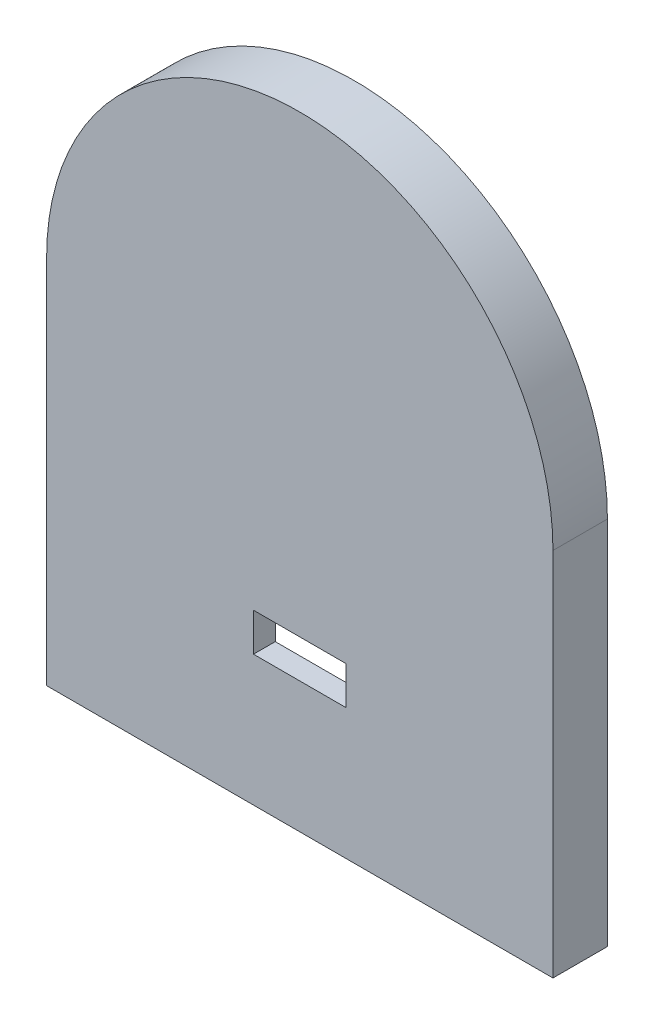
ISO-10303-21;
HEADER;
FILE_DESCRIPTION(('STEP AP214'),'2;1');
FILE_NAME('part.step','',(''),(''),'','','');
FILE_SCHEMA(('AUTOMOTIVE_DESIGN { 1 0 10303 214 1 1 1 1 }'));
ENDSEC;
DATA;
#1=APPLICATION_CONTEXT('core data for automotive mechanical design processes');
#2=APPLICATION_PROTOCOL_DEFINITION('international standard','automotive_design',2000,#1);
#3=PRODUCT_CONTEXT('',#1,'mechanical');
#4=PRODUCT('Part','Part','',(#3));
#5=PRODUCT_RELATED_PRODUCT_CATEGORY('part','',(#4));
#6=PRODUCT_DEFINITION_FORMATION('','',#4);
#7=PRODUCT_DEFINITION_CONTEXT('part definition',#1,'design');
#8=PRODUCT_DEFINITION('design','',#6,#7);
#9=PRODUCT_DEFINITION_SHAPE('','',#8);
#10=(LENGTH_UNIT() NAMED_UNIT(*) SI_UNIT(.MILLI.,.METRE.));
#11=(NAMED_UNIT(*) PLANE_ANGLE_UNIT() SI_UNIT($,.RADIAN.));
#12=(NAMED_UNIT(*) SI_UNIT($,.STERADIAN.) SOLID_ANGLE_UNIT());
#13=UNCERTAINTY_MEASURE_WITH_UNIT(LENGTH_MEASURE(1.E-05),#10,'distance_accuracy_value','');
#14=(GEOMETRIC_REPRESENTATION_CONTEXT(3) GLOBAL_UNCERTAINTY_ASSIGNED_CONTEXT((#13)) GLOBAL_UNIT_ASSIGNED_CONTEXT((#10,
#11,#12)) REPRESENTATION_CONTEXT('',''));
#15=CARTESIAN_POINT('',(0.,0.,0.));
#16=DIRECTION('',(0.,0.,1.));
#17=DIRECTION('',(1.,0.,0.));
#18=AXIS2_PLACEMENT_3D('',#15,#16,#17);
#19=CARTESIAN_POINT('',(23.25,34.,0.));
#20=DIRECTION('',(0.,0.,-1.));
#21=DIRECTION('',(-1.,0.,0.));
#22=AXIS2_PLACEMENT_3D('',#19,#20,#21);
#23=PLANE('',#22);
#24=DIRECTION('',(0.,-1.,0.));
#25=VECTOR('',#24,1.);
#26=CARTESIAN_POINT('',(0.,0.,0.));
#27=LINE('',#26,#25);
#28=CARTESIAN_POINT('',(0.,34.,0.));
#29=VERTEX_POINT('',#28);
#30=CARTESIAN_POINT('',(0.,0.,0.));
#31=VERTEX_POINT('',#30);
#32=EDGE_CURVE('E299',#29,#31,#27,.T.);
#33=ORIENTED_EDGE('',*,*,#32,.F.);
#34=CARTESIAN_POINT('',(23.25,34.,0.));
#35=DIRECTION('',(0.,0.,1.));
#36=DIRECTION('',(-1.,0.,0.));
#37=AXIS2_PLACEMENT_3D('',#34,#35,#36);
#38=CIRCLE('',#37,23.25);
#39=CARTESIAN_POINT('',(46.5,34.,0.));
#40=VERTEX_POINT('',#39);
#41=EDGE_CURVE('E306',#40,#29,#38,.T.);
#42=ORIENTED_EDGE('',*,*,#41,.F.);
#43=DIRECTION('',(0.,1.,0.));
#44=VECTOR('',#43,1.);
#45=CARTESIAN_POINT('',(46.5,0.,0.));
#46=LINE('',#45,#44);
#47=CARTESIAN_POINT('',(46.5,0.,0.));
#48=VERTEX_POINT('',#47);
#49=EDGE_CURVE('E304',#48,#40,#46,.T.);
#50=ORIENTED_EDGE('',*,*,#49,.F.);
#51=DIRECTION('',(1.,0.,0.));
#52=VECTOR('',#51,1.);
#53=CARTESIAN_POINT('',(0.,0.,0.));
#54=LINE('',#53,#52);
#55=EDGE_CURVE('E302',#31,#48,#54,.T.);
#56=ORIENTED_EDGE('',*,*,#55,.F.);
#57=EDGE_LOOP('',(#33,#42,#50,#56));
#58=FACE_BOUND('',#57,.T.);
#59=DIRECTION('',(0.,-1.,0.));
#60=VECTOR('',#59,1.);
#61=CARTESIAN_POINT('',(2.,2.,0.));
#62=LINE('',#61,#60);
#63=CARTESIAN_POINT('',(2.,34.,0.));
#64=VERTEX_POINT('',#63);
#65=CARTESIAN_POINT('',(2.,28.7,0.));
#66=VERTEX_POINT('',#65);
#67=EDGE_CURVE('E267',#64,#66,#62,.T.);
#68=ORIENTED_EDGE('',*,*,#67,.T.);
#69=DIRECTION('',(0.,-1.,0.));
#70=VECTOR('',#69,1.);
#71=CARTESIAN_POINT('',(2.,28.7,0.));
#72=LINE('',#71,#70);
#73=CARTESIAN_POINT('',(2.,11.2,0.));
#74=VERTEX_POINT('',#73);
#75=EDGE_CURVE('E244',#66,#74,#72,.T.);
#76=ORIENTED_EDGE('',*,*,#75,.T.);
#77=CARTESIAN_POINT('',(2.,2.,0.));
#78=VERTEX_POINT('',#77);
#79=EDGE_CURVE('E286',#74,#78,#62,.T.);
#80=ORIENTED_EDGE('',*,*,#79,.T.);
#81=DIRECTION('',(1.,0.,0.));
#82=VECTOR('',#81,1.);
#83=CARTESIAN_POINT('',(2.,2.,0.));
#84=LINE('',#83,#82);
#85=CARTESIAN_POINT('',(44.5,2.,0.));
#86=VERTEX_POINT('',#85);
#87=EDGE_CURVE('E262',#78,#86,#84,.T.);
#88=ORIENTED_EDGE('',*,*,#87,.T.);
#89=DIRECTION('',(0.,1.,0.));
#90=VECTOR('',#89,1.);
#91=CARTESIAN_POINT('',(44.5,2.,0.));
#92=LINE('',#91,#90);
#93=CARTESIAN_POINT('',(44.5,11.2,0.));
#94=VERTEX_POINT('',#93);
#95=EDGE_CURVE('E280',#86,#94,#92,.T.);
#96=ORIENTED_EDGE('',*,*,#95,.T.);
#97=DIRECTION('',(0.,-1.,0.));
#98=VECTOR('',#97,1.);
#99=CARTESIAN_POINT('',(44.5,28.7,0.));
#100=LINE('',#99,#98);
#101=CARTESIAN_POINT('',(44.5,28.7,0.));
#102=VERTEX_POINT('',#101);
#103=EDGE_CURVE('E220',#102,#94,#100,.T.);
#104=ORIENTED_EDGE('',*,*,#103,.F.);
#105=CARTESIAN_POINT('',(44.5,34.,0.));
#106=VERTEX_POINT('',#105);
#107=EDGE_CURVE('E279',#102,#106,#92,.T.);
#108=ORIENTED_EDGE('',*,*,#107,.T.);
#109=CARTESIAN_POINT('',(23.25,34.,0.));
#110=DIRECTION('',(0.,0.,1.));
#111=DIRECTION('',(-1.,0.,0.));
#112=AXIS2_PLACEMENT_3D('',#109,#110,#111);
#113=CIRCLE('',#112,21.25);
#114=EDGE_CURVE('E283',#106,#64,#113,.T.);
#115=ORIENTED_EDGE('',*,*,#114,.T.);
#116=EDGE_LOOP('',(#68,#76,#80,#88,#96,#104,#108,#115));
#117=FACE_BOUND('',#116,.T.);
#118=ADVANCED_FACE('F40',(#58,#117),#23,.T.);
#119=CARTESIAN_POINT('',(0.,0.,3.));
#120=DIRECTION('',(1.,0.,0.));
#121=DIRECTION('',(0.,1.,0.));
#122=AXIS2_PLACEMENT_3D('',#119,#120,#121);
#123=PLANE('',#122);
#124=ORIENTED_EDGE('',*,*,#32,.T.);
#125=DIRECTION('',(0.,0.,-1.));
#126=VECTOR('',#125,1.);
#127=CARTESIAN_POINT('',(0.,0.,3.));
#128=LINE('',#127,#126);
#129=CARTESIAN_POINT('',(0.,0.,5.));
#130=VERTEX_POINT('',#129);
#131=EDGE_CURVE('E11',#130,#31,#128,.T.);
#132=ORIENTED_EDGE('',*,*,#131,.F.);
#133=DIRECTION('',(0.,-1.,0.));
#134=VECTOR('',#133,1.);
#135=CARTESIAN_POINT('',(0.,34.,5.));
#136=LINE('',#135,#134);
#137=CARTESIAN_POINT('',(0.,34.,5.));
#138=VERTEX_POINT('',#137);
#139=EDGE_CURVE('E253',#138,#130,#136,.T.);
#140=ORIENTED_EDGE('',*,*,#139,.F.);
#141=DIRECTION('',(0.,0.,-1.));
#142=VECTOR('',#141,1.);
#143=CARTESIAN_POINT('',(0.,34.,3.));
#144=LINE('',#143,#142);
#145=EDGE_CURVE('E308',#138,#29,#144,.T.);
#146=ORIENTED_EDGE('',*,*,#145,.T.);
#147=EDGE_LOOP('',(#124,#132,#140,#146));
#148=FACE_BOUND('',#147,.T.);
#149=ADVANCED_FACE('F42',(#148),#123,.F.);
#150=CARTESIAN_POINT('',(0.,0.,3.));
#151=DIRECTION('',(0.,1.,0.));
#152=DIRECTION('',(0.,0.,1.));
#153=AXIS2_PLACEMENT_3D('',#150,#151,#152);
#154=PLANE('',#153);
#155=ORIENTED_EDGE('',*,*,#55,.T.);
#156=DIRECTION('',(0.,0.,-1.));
#157=VECTOR('',#156,1.);
#158=CARTESIAN_POINT('',(46.5,0.,3.));
#159=LINE('',#158,#157);
#160=CARTESIAN_POINT('',(46.5,0.,5.));
#161=VERTEX_POINT('',#160);
#162=EDGE_CURVE('E48',#161,#48,#159,.T.);
#163=ORIENTED_EDGE('',*,*,#162,.F.);
#164=DIRECTION('',(1.,0.,0.));
#165=VECTOR('',#164,1.);
#166=CARTESIAN_POINT('',(0.,0.,5.));
#167=LINE('',#166,#165);
#168=EDGE_CURVE('E256',#130,#161,#167,.T.);
#169=ORIENTED_EDGE('',*,*,#168,.F.);
#170=ORIENTED_EDGE('',*,*,#131,.T.);
#171=EDGE_LOOP('',(#155,#163,#169,#170));
#172=FACE_BOUND('',#171,.T.);
#173=ADVANCED_FACE('F329',(#172),#154,.F.);
#174=CARTESIAN_POINT('',(46.5,0.,3.));
#175=DIRECTION('',(-1.,0.,0.));
#176=DIRECTION('',(0.,-1.,0.));
#177=AXIS2_PLACEMENT_3D('',#174,#175,#176);
#178=PLANE('',#177);
#179=ORIENTED_EDGE('',*,*,#49,.T.);
#180=DIRECTION('',(0.,0.,-1.));
#181=VECTOR('',#180,1.);
#182=CARTESIAN_POINT('',(46.5,34.,3.));
#183=LINE('',#182,#181);
#184=CARTESIAN_POINT('',(46.5,34.,5.));
#185=VERTEX_POINT('',#184);
#186=EDGE_CURVE('E311',#185,#40,#183,.T.);
#187=ORIENTED_EDGE('',*,*,#186,.F.);
#188=DIRECTION('',(0.,1.,0.));
#189=VECTOR('',#188,1.);
#190=CARTESIAN_POINT('',(46.5,0.,5.));
#191=LINE('',#190,#189);
#192=EDGE_CURVE('E259',#161,#185,#191,.T.);
#193=ORIENTED_EDGE('',*,*,#192,.F.);
#194=ORIENTED_EDGE('',*,*,#162,.T.);
#195=EDGE_LOOP('',(#179,#187,#193,#194));
#196=FACE_BOUND('',#195,.T.);
#197=ADVANCED_FACE('F317',(#196),#178,.F.);
#198=CARTESIAN_POINT('',(23.25,34.,3.));
#199=DIRECTION('',(0.,0.,-1.));
#200=DIRECTION('',(-1.,0.,0.));
#201=AXIS2_PLACEMENT_3D('',#198,#199,#200);
#202=CYLINDRICAL_SURFACE('',#201,23.25);
#203=ORIENTED_EDGE('',*,*,#41,.T.);
#204=ORIENTED_EDGE('',*,*,#145,.F.);
#205=CARTESIAN_POINT('',(23.25,34.,5.));
#206=DIRECTION('',(0.,0.,1.));
#207=DIRECTION('',(1.,0.,0.));
#208=AXIS2_PLACEMENT_3D('',#205,#206,#207);
#209=CIRCLE('',#208,23.25);
#210=EDGE_CURVE('E250',#185,#138,#209,.T.);
#211=ORIENTED_EDGE('',*,*,#210,.F.);
#212=ORIENTED_EDGE('',*,*,#186,.T.);
#213=EDGE_LOOP('',(#203,#204,#211,#212));
#214=FACE_BOUND('',#213,.T.);
#215=ADVANCED_FACE('F325',(#214),#202,.T.);
#216=CARTESIAN_POINT('',(2.,2.,3.));
#217=DIRECTION('',(0.,1.,0.));
#218=DIRECTION('',(0.,0.,1.));
#219=AXIS2_PLACEMENT_3D('',#216,#217,#218);
#220=PLANE('',#219);
#221=ORIENTED_EDGE('',*,*,#87,.F.);
#222=DIRECTION('',(0.,0.,-1.));
#223=VECTOR('',#222,1.);
#224=CARTESIAN_POINT('',(2.,2.,3.));
#225=LINE('',#224,#223);
#226=CARTESIAN_POINT('',(2.,2.,3.));
#227=VERTEX_POINT('',#226);
#228=EDGE_CURVE('E276',#227,#78,#225,.T.);
#229=ORIENTED_EDGE('',*,*,#228,.F.);
#230=DIRECTION('',(1.,0.,0.));
#231=VECTOR('',#230,1.);
#232=CARTESIAN_POINT('',(2.,2.,3.));
#233=LINE('',#232,#231);
#234=CARTESIAN_POINT('',(44.5,2.,3.));
#235=VERTEX_POINT('',#234);
#236=EDGE_CURVE('E263',#227,#235,#233,.T.);
#237=ORIENTED_EDGE('',*,*,#236,.T.);
#238=DIRECTION('',(0.,0.,-1.));
#239=VECTOR('',#238,1.);
#240=CARTESIAN_POINT('',(44.5,2.,3.));
#241=LINE('',#240,#239);
#242=EDGE_CURVE('E296',#235,#86,#241,.T.);
#243=ORIENTED_EDGE('',*,*,#242,.T.);
#244=EDGE_LOOP('',(#221,#229,#237,#243));
#245=FACE_BOUND('',#244,.T.);
#246=ADVANCED_FACE('F342',(#245),#220,.T.);
#247=CARTESIAN_POINT('',(44.5,2.,3.));
#248=DIRECTION('',(-1.,0.,0.));
#249=DIRECTION('',(0.,0.,1.));
#250=AXIS2_PLACEMENT_3D('',#247,#248,#249);
#251=PLANE('',#250);
#252=DIRECTION('',(0.,0.,1.));
#253=VECTOR('',#252,1.);
#254=CARTESIAN_POINT('',(44.5,28.7,0.));
#255=LINE('',#254,#253);
#256=CARTESIAN_POINT('',(44.5,28.7,2.00000000000001));
#257=VERTEX_POINT('',#256);
#258=EDGE_CURVE('E205',#102,#257,#255,.T.);
#259=ORIENTED_EDGE('',*,*,#258,.T.);
#260=DIRECTION('',(0.,-1.,0.));
#261=VECTOR('',#260,1.);
#262=CARTESIAN_POINT('',(44.5,28.7,2.00000000000001));
#263=LINE('',#262,#261);
#264=CARTESIAN_POINT('',(44.5,11.2,2.00000000000001));
#265=VERTEX_POINT('',#264);
#266=EDGE_CURVE('E223',#257,#265,#263,.T.);
#267=ORIENTED_EDGE('',*,*,#266,.T.);
#268=DIRECTION('',(0.,0.,1.));
#269=VECTOR('',#268,1.);
#270=CARTESIAN_POINT('',(44.5,11.2,0.));
#271=LINE('',#270,#269);
#272=EDGE_CURVE('E215',#94,#265,#271,.T.);
#273=ORIENTED_EDGE('',*,*,#272,.F.);
#274=ORIENTED_EDGE('',*,*,#95,.F.);
#275=ORIENTED_EDGE('',*,*,#242,.F.);
#276=DIRECTION('',(0.,1.,0.));
#277=VECTOR('',#276,1.);
#278=CARTESIAN_POINT('',(44.5,2.,3.));
#279=LINE('',#278,#277);
#280=CARTESIAN_POINT('',(44.5,34.,3.));
#281=VERTEX_POINT('',#280);
#282=EDGE_CURVE('E266',#235,#281,#279,.T.);
#283=ORIENTED_EDGE('',*,*,#282,.T.);
#284=DIRECTION('',(0.,0.,-1.));
#285=VECTOR('',#284,1.);
#286=CARTESIAN_POINT('',(44.5,34.,3.));
#287=LINE('',#286,#285);
#288=EDGE_CURVE('E293',#281,#106,#287,.T.);
#289=ORIENTED_EDGE('',*,*,#288,.T.);
#290=ORIENTED_EDGE('',*,*,#107,.F.);
#291=EDGE_LOOP('',(#259,#267,#273,#274,#275,#283,#289,#290));
#292=FACE_BOUND('',#291,.T.);
#293=ADVANCED_FACE('F348',(#292),#251,.T.);
#294=CARTESIAN_POINT('',(23.25,34.,3.));
#295=DIRECTION('',(0.,0.,-1.));
#296=DIRECTION('',(-1.,0.,0.));
#297=AXIS2_PLACEMENT_3D('',#294,#295,#296);
#298=CYLINDRICAL_SURFACE('',#297,21.25);
#299=ORIENTED_EDGE('',*,*,#114,.F.);
#300=ORIENTED_EDGE('',*,*,#288,.F.);
#301=CARTESIAN_POINT('',(23.25,34.,3.));
#302=DIRECTION('',(0.,0.,1.));
#303=DIRECTION('',(-1.,0.,0.));
#304=AXIS2_PLACEMENT_3D('',#301,#302,#303);
#305=CIRCLE('',#304,21.25);
#306=CARTESIAN_POINT('',(2.,34.,3.));
#307=VERTEX_POINT('',#306);
#308=EDGE_CURVE('E270',#281,#307,#305,.T.);
#309=ORIENTED_EDGE('',*,*,#308,.T.);
#310=DIRECTION('',(0.,0.,-1.));
#311=VECTOR('',#310,1.);
#312=CARTESIAN_POINT('',(2.,34.,3.));
#313=LINE('',#312,#311);
#314=EDGE_CURVE('E291',#307,#64,#313,.T.);
#315=ORIENTED_EDGE('',*,*,#314,.T.);
#316=EDGE_LOOP('',(#299,#300,#309,#315));
#317=FACE_BOUND('',#316,.T.);
#318=ADVANCED_FACE('F353',(#317),#298,.F.);
#319=CARTESIAN_POINT('',(2.,2.,3.));
#320=DIRECTION('',(1.,0.,0.));
#321=DIRECTION('',(0.,0.,-1.));
#322=AXIS2_PLACEMENT_3D('',#319,#320,#321);
#323=PLANE('',#322);
#324=DIRECTION('',(0.,0.,1.));
#325=VECTOR('',#324,1.);
#326=CARTESIAN_POINT('',(2.,28.7,0.));
#327=LINE('',#326,#325);
#328=CARTESIAN_POINT('',(2.,28.7,2.00000000000001));
#329=VERTEX_POINT('',#328);
#330=EDGE_CURVE('E233',#66,#329,#327,.T.);
#331=ORIENTED_EDGE('',*,*,#330,.F.);
#332=ORIENTED_EDGE('',*,*,#67,.F.);
#333=ORIENTED_EDGE('',*,*,#314,.F.);
#334=DIRECTION('',(0.,-1.,0.));
#335=VECTOR('',#334,1.);
#336=CARTESIAN_POINT('',(2.,2.,3.));
#337=LINE('',#336,#335);
#338=EDGE_CURVE('E273',#307,#227,#337,.T.);
#339=ORIENTED_EDGE('',*,*,#338,.T.);
#340=ORIENTED_EDGE('',*,*,#228,.T.);
#341=ORIENTED_EDGE('',*,*,#79,.F.);
#342=DIRECTION('',(0.,0.,1.));
#343=VECTOR('',#342,1.);
#344=CARTESIAN_POINT('',(2.,11.2,0.));
#345=LINE('',#344,#343);
#346=CARTESIAN_POINT('',(2.,11.2,2.00000000000001));
#347=VERTEX_POINT('',#346);
#348=EDGE_CURVE('E231',#74,#347,#345,.T.);
#349=ORIENTED_EDGE('',*,*,#348,.T.);
#350=DIRECTION('',(0.,-1.,0.));
#351=VECTOR('',#350,1.);
#352=CARTESIAN_POINT('',(2.,28.7,2.00000000000001));
#353=LINE('',#352,#351);
#354=EDGE_CURVE('E235',#329,#347,#353,.T.);
#355=ORIENTED_EDGE('',*,*,#354,.F.);
#356=EDGE_LOOP('',(#331,#332,#333,#339,#340,#341,#349,#355));
#357=FACE_BOUND('',#356,.T.);
#358=ADVANCED_FACE('F361',(#357),#323,.T.);
#359=CARTESIAN_POINT('',(23.25,34.,3.));
#360=DIRECTION('',(0.,0.,1.));
#361=DIRECTION('',(1.,0.,0.));
#362=AXIS2_PLACEMENT_3D('',#359,#360,#361);
#363=PLANE('',#362);
#364=DIRECTION('',(1.,0.,0.));
#365=VECTOR('',#364,1.);
#366=CARTESIAN_POINT('',(27.5,15.5,3.));
#367=LINE('',#366,#365);
#368=CARTESIAN_POINT('',(19.,15.5,3.));
#369=VERTEX_POINT('',#368);
#370=CARTESIAN_POINT('',(27.5,15.5,3.));
#371=VERTEX_POINT('',#370);
#372=EDGE_CURVE('E192',#369,#371,#367,.T.);
#373=ORIENTED_EDGE('',*,*,#372,.F.);
#374=DIRECTION('',(0.,1.,0.));
#375=VECTOR('',#374,1.);
#376=CARTESIAN_POINT('',(19.,12.,3.));
#377=LINE('',#376,#375);
#378=CARTESIAN_POINT('',(19.,12.,3.));
#379=VERTEX_POINT('',#378);
#380=EDGE_CURVE('E55',#379,#369,#377,.T.);
#381=ORIENTED_EDGE('',*,*,#380,.F.);
#382=DIRECTION('',(-1.,0.,0.));
#383=VECTOR('',#382,1.);
#384=CARTESIAN_POINT('',(27.5,12.,3.));
#385=LINE('',#384,#383);
#386=CARTESIAN_POINT('',(27.5,12.,3.));
#387=VERTEX_POINT('',#386);
#388=EDGE_CURVE('E183',#387,#379,#385,.T.);
#389=ORIENTED_EDGE('',*,*,#388,.F.);
#390=DIRECTION('',(0.,-1.,0.));
#391=VECTOR('',#390,1.);
#392=CARTESIAN_POINT('',(27.5,12.,3.));
#393=LINE('',#392,#391);
#394=EDGE_CURVE('E186',#371,#387,#393,.T.);
#395=ORIENTED_EDGE('',*,*,#394,.F.);
#396=EDGE_LOOP('',(#373,#381,#389,#395));
#397=FACE_BOUND('',#396,.T.);
#398=ORIENTED_EDGE('',*,*,#236,.F.);
#399=ORIENTED_EDGE('',*,*,#338,.F.);
#400=ORIENTED_EDGE('',*,*,#308,.F.);
#401=ORIENTED_EDGE('',*,*,#282,.F.);
#402=EDGE_LOOP('',(#398,#399,#400,#401));
#403=FACE_BOUND('',#402,.T.);
#404=ADVANCED_FACE('F365',(#397,#403),#363,.F.);
#405=CARTESIAN_POINT('',(23.25,34.,5.));
#406=DIRECTION('',(0.,0.,1.));
#407=DIRECTION('',(1.,0.,0.));
#408=AXIS2_PLACEMENT_3D('',#405,#406,#407);
#409=PLANE('',#408);
#410=DIRECTION('',(0.,1.,0.));
#411=VECTOR('',#410,1.);
#412=CARTESIAN_POINT('',(19.,12.,5.));
#413=LINE('',#412,#411);
#414=CARTESIAN_POINT('',(19.,12.,5.));
#415=VERTEX_POINT('',#414);
#416=CARTESIAN_POINT('',(19.,15.5,5.));
#417=VERTEX_POINT('',#416);
#418=EDGE_CURVE('E167',#415,#417,#413,.T.);
#419=ORIENTED_EDGE('',*,*,#418,.T.);
#420=DIRECTION('',(1.,0.,0.));
#421=VECTOR('',#420,1.);
#422=CARTESIAN_POINT('',(27.5,15.5,5.));
#423=LINE('',#422,#421);
#424=CARTESIAN_POINT('',(27.5,15.5,5.));
#425=VERTEX_POINT('',#424);
#426=EDGE_CURVE('E176',#417,#425,#423,.T.);
#427=ORIENTED_EDGE('',*,*,#426,.T.);
#428=DIRECTION('',(0.,-1.,0.));
#429=VECTOR('',#428,1.);
#430=CARTESIAN_POINT('',(27.5,12.,5.));
#431=LINE('',#430,#429);
#432=CARTESIAN_POINT('',(27.5,12.,5.));
#433=VERTEX_POINT('',#432);
#434=EDGE_CURVE('E63',#425,#433,#431,.T.);
#435=ORIENTED_EDGE('',*,*,#434,.T.);
#436=DIRECTION('',(-1.,0.,0.));
#437=VECTOR('',#436,1.);
#438=CARTESIAN_POINT('',(27.5,12.,5.));
#439=LINE('',#438,#437);
#440=EDGE_CURVE('E173',#433,#415,#439,.T.);
#441=ORIENTED_EDGE('',*,*,#440,.T.);
#442=EDGE_LOOP('',(#419,#427,#435,#441));
#443=FACE_BOUND('',#442,.T.);
#444=ORIENTED_EDGE('',*,*,#210,.T.);
#445=ORIENTED_EDGE('',*,*,#139,.T.);
#446=ORIENTED_EDGE('',*,*,#168,.T.);
#447=ORIENTED_EDGE('',*,*,#192,.T.);
#448=EDGE_LOOP('',(#444,#445,#446,#447));
#449=FACE_BOUND('',#448,.T.);
#450=ADVANCED_FACE('F180',(#443,#449),#409,.T.);
#451=CARTESIAN_POINT('',(1.36602540378442,28.7,2.36602540378445));
#452=DIRECTION('',(-0.499999999999992,0.,-0.866025403784443));
#453=DIRECTION('',(-0.866025403784443,0.,0.499999999999992));
#454=AXIS2_PLACEMENT_3D('',#451,#452,#453);
#455=PLANE('',#454);
#456=DIRECTION('',(0.866025403784443,0.,-0.499999999999992));
#457=VECTOR('',#456,1.);
#458=CARTESIAN_POINT('',(1.36602540378442,11.2,2.36602540378445));
#459=LINE('',#458,#457);
#460=CARTESIAN_POINT('',(3.73205080756889,11.2,1.00000000000002));
#461=VERTEX_POINT('',#460);
#462=EDGE_CURVE('E226',#347,#461,#459,.T.);
#463=ORIENTED_EDGE('',*,*,#462,.T.);
#464=DIRECTION('',(0.,-1.,0.));
#465=VECTOR('',#464,1.);
#466=CARTESIAN_POINT('',(3.73205080756889,28.7,1.00000000000002));
#467=LINE('',#466,#465);
#468=CARTESIAN_POINT('',(3.73205080756889,28.7,1.00000000000002));
#469=VERTEX_POINT('',#468);
#470=EDGE_CURVE('E247',#469,#461,#467,.T.);
#471=ORIENTED_EDGE('',*,*,#470,.F.);
#472=DIRECTION('',(0.866025403784443,0.,-0.499999999999992));
#473=VECTOR('',#472,1.);
#474=CARTESIAN_POINT('',(1.36602540378442,28.7,2.36602540378445));
#475=LINE('',#474,#473);
#476=EDGE_CURVE('E227',#329,#469,#475,.T.);
#477=ORIENTED_EDGE('',*,*,#476,.F.);
#478=ORIENTED_EDGE('',*,*,#354,.T.);
#479=EDGE_LOOP('',(#463,#471,#477,#478));
#480=FACE_BOUND('',#479,.T.);
#481=ADVANCED_FACE('F385',(#480),#455,.F.);
#482=CARTESIAN_POINT('',(0.500000000000005,28.7,-0.866025403784438));
#483=DIRECTION('',(-0.500000000000004,0.,0.866025403784436));
#484=DIRECTION('',(0.866025403784436,0.,0.500000000000004));
#485=AXIS2_PLACEMENT_3D('',#482,#483,#484);
#486=PLANE('',#485);
#487=DIRECTION('',(-0.866025403784436,0.,-0.500000000000004));
#488=VECTOR('',#487,1.);
#489=CARTESIAN_POINT('',(0.500000000000005,11.2,-0.866025403784438));
#490=LINE('',#489,#488);
#491=EDGE_CURVE('E238',#461,#74,#490,.T.);
#492=ORIENTED_EDGE('',*,*,#491,.T.);
#493=ORIENTED_EDGE('',*,*,#75,.F.);
#494=DIRECTION('',(-0.866025403784436,0.,-0.500000000000004));
#495=VECTOR('',#494,1.);
#496=CARTESIAN_POINT('',(0.500000000000005,28.7,-0.866025403784438));
#497=LINE('',#496,#495);
#498=EDGE_CURVE('E230',#469,#66,#497,.T.);
#499=ORIENTED_EDGE('',*,*,#498,.F.);
#500=ORIENTED_EDGE('',*,*,#470,.T.);
#501=EDGE_LOOP('',(#492,#493,#499,#500));
#502=FACE_BOUND('',#501,.T.);
#503=ADVANCED_FACE('F387',(#502),#486,.F.);
#504=CARTESIAN_POINT('',(0.,28.7,0.));
#505=DIRECTION('',(0.,1.,0.));
#506=DIRECTION('',(0.,0.,1.));
#507=AXIS2_PLACEMENT_3D('',#504,#505,#506);
#508=PLANE('',#507);
#509=ORIENTED_EDGE('',*,*,#476,.T.);
#510=ORIENTED_EDGE('',*,*,#498,.T.);
#511=ORIENTED_EDGE('',*,*,#330,.T.);
#512=EDGE_LOOP('',(#509,#510,#511));
#513=FACE_BOUND('',#512,.T.);
#514=ADVANCED_FACE('F382',(#513),#508,.T.);
#515=CARTESIAN_POINT('',(0.,11.2,0.));
#516=DIRECTION('',(0.,1.,0.));
#517=DIRECTION('',(0.,0.,1.));
#518=AXIS2_PLACEMENT_3D('',#515,#516,#517);
#519=PLANE('',#518);
#520=ORIENTED_EDGE('',*,*,#462,.F.);
#521=ORIENTED_EDGE('',*,*,#348,.F.);
#522=ORIENTED_EDGE('',*,*,#491,.F.);
#523=EDGE_LOOP('',(#520,#521,#522));
#524=FACE_BOUND('',#523,.T.);
#525=ADVANCED_FACE('F390',(#524),#519,.F.);
#526=CARTESIAN_POINT('',(45.1339745962156,28.7,2.36602540378445));
#527=DIRECTION('',(-0.499999999999992,0.,0.866025403784443));
#528=DIRECTION('',(0.866025403784443,0.,0.499999999999992));
#529=AXIS2_PLACEMENT_3D('',#526,#527,#528);
#530=PLANE('',#529);
#531=DIRECTION('',(-0.866025403784443,0.,-0.499999999999992));
#532=VECTOR('',#531,1.);
#533=CARTESIAN_POINT('',(45.1339745962156,11.2,2.36602540378445));
#534=LINE('',#533,#532);
#535=CARTESIAN_POINT('',(42.7679491924311,11.2,1.00000000000002));
#536=VERTEX_POINT('',#535);
#537=EDGE_CURVE('E198',#265,#536,#534,.T.);
#538=ORIENTED_EDGE('',*,*,#537,.F.);
#539=ORIENTED_EDGE('',*,*,#266,.F.);
#540=DIRECTION('',(-0.866025403784443,0.,-0.499999999999992));
#541=VECTOR('',#540,1.);
#542=CARTESIAN_POINT('',(45.1339745962156,28.7,2.36602540378445));
#543=LINE('',#542,#541);
#544=CARTESIAN_POINT('',(42.7679491924311,28.7,1.00000000000002));
#545=VERTEX_POINT('',#544);
#546=EDGE_CURVE('E202',#257,#545,#543,.T.);
#547=ORIENTED_EDGE('',*,*,#546,.T.);
#548=DIRECTION('',(0.,-1.,0.));
#549=VECTOR('',#548,1.);
#550=CARTESIAN_POINT('',(42.7679491924311,28.7,1.00000000000002));
#551=LINE('',#550,#549);
#552=EDGE_CURVE('E212',#545,#536,#551,.T.);
#553=ORIENTED_EDGE('',*,*,#552,.T.);
#554=EDGE_LOOP('',(#538,#539,#547,#553));
#555=FACE_BOUND('',#554,.T.);
#556=ADVANCED_FACE('F392',(#555),#530,.T.);
#557=CARTESIAN_POINT('',(46.,28.7,-0.866025403784438));
#558=DIRECTION('',(-0.500000000000004,0.,-0.866025403784436));
#559=DIRECTION('',(-0.866025403784436,0.,0.500000000000004));
#560=AXIS2_PLACEMENT_3D('',#557,#558,#559);
#561=PLANE('',#560);
#562=DIRECTION('',(0.866025403784436,0.,-0.500000000000004));
#563=VECTOR('',#562,1.);
#564=CARTESIAN_POINT('',(46.,11.2,-0.866025403784438));
#565=LINE('',#564,#563);
#566=EDGE_CURVE('E206',#536,#94,#565,.T.);
#567=ORIENTED_EDGE('',*,*,#566,.F.);
#568=ORIENTED_EDGE('',*,*,#552,.F.);
#569=DIRECTION('',(0.866025403784436,0.,-0.500000000000004));
#570=VECTOR('',#569,1.);
#571=CARTESIAN_POINT('',(46.,28.7,-0.866025403784438));
#572=LINE('',#571,#570);
#573=EDGE_CURVE('E209',#545,#102,#572,.T.);
#574=ORIENTED_EDGE('',*,*,#573,.T.);
#575=ORIENTED_EDGE('',*,*,#103,.T.);
#576=EDGE_LOOP('',(#567,#568,#574,#575));
#577=FACE_BOUND('',#576,.T.);
#578=ADVANCED_FACE('F372',(#577),#561,.T.);
#579=CARTESIAN_POINT('',(46.5,28.7,0.));
#580=DIRECTION('',(0.,1.,0.));
#581=DIRECTION('',(0.,0.,1.));
#582=AXIS2_PLACEMENT_3D('',#579,#580,#581);
#583=PLANE('',#582);
#584=ORIENTED_EDGE('',*,*,#546,.F.);
#585=ORIENTED_EDGE('',*,*,#258,.F.);
#586=ORIENTED_EDGE('',*,*,#573,.F.);
#587=EDGE_LOOP('',(#584,#585,#586));
#588=FACE_BOUND('',#587,.T.);
#589=ADVANCED_FACE('F473',(#588),#583,.T.);
#590=CARTESIAN_POINT('',(46.5,11.2,0.));
#591=DIRECTION('',(0.,1.,0.));
#592=DIRECTION('',(0.,0.,1.));
#593=AXIS2_PLACEMENT_3D('',#590,#591,#592);
#594=PLANE('',#593);
#595=ORIENTED_EDGE('',*,*,#537,.T.);
#596=ORIENTED_EDGE('',*,*,#566,.T.);
#597=ORIENTED_EDGE('',*,*,#272,.T.);
#598=EDGE_LOOP('',(#595,#596,#597));
#599=FACE_BOUND('',#598,.T.);
#600=ADVANCED_FACE('F481',(#599),#594,.F.);
#601=CARTESIAN_POINT('',(19.,12.,5.));
#602=DIRECTION('',(-1.,0.,0.));
#603=DIRECTION('',(0.,0.,1.));
#604=AXIS2_PLACEMENT_3D('',#601,#602,#603);
#605=PLANE('',#604);
#606=ORIENTED_EDGE('',*,*,#380,.T.);
#607=DIRECTION('',(0.,0.,-1.));
#608=VECTOR('',#607,1.);
#609=CARTESIAN_POINT('',(19.,15.5,5.));
#610=LINE('',#609,#608);
#611=EDGE_CURVE('E163',#417,#369,#610,.T.);
#612=ORIENTED_EDGE('',*,*,#611,.F.);
#613=ORIENTED_EDGE('',*,*,#418,.F.);
#614=DIRECTION('',(0.,0.,-1.));
#615=VECTOR('',#614,1.);
#616=CARTESIAN_POINT('',(19.,12.,5.));
#617=LINE('',#616,#615);
#618=EDGE_CURVE('E196',#415,#379,#617,.T.);
#619=ORIENTED_EDGE('',*,*,#618,.T.);
#620=EDGE_LOOP('',(#606,#612,#613,#619));
#621=FACE_BOUND('',#620,.T.);
#622=ADVANCED_FACE('F165',(#621),#605,.F.);
#623=CARTESIAN_POINT('',(27.5,12.,5.));
#624=DIRECTION('',(0.,-1.,0.));
#625=DIRECTION('',(0.,0.,-1.));
#626=AXIS2_PLACEMENT_3D('',#623,#624,#625);
#627=PLANE('',#626);
#628=ORIENTED_EDGE('',*,*,#388,.T.);
#629=ORIENTED_EDGE('',*,*,#618,.F.);
#630=ORIENTED_EDGE('',*,*,#440,.F.);
#631=DIRECTION('',(0.,0.,-1.));
#632=VECTOR('',#631,1.);
#633=CARTESIAN_POINT('',(27.5,12.,5.));
#634=LINE('',#633,#632);
#635=EDGE_CURVE('E199',#433,#387,#634,.T.);
#636=ORIENTED_EDGE('',*,*,#635,.T.);
#637=EDGE_LOOP('',(#628,#629,#630,#636));
#638=FACE_BOUND('',#637,.T.);
#639=ADVANCED_FACE('F498',(#638),#627,.F.);
#640=CARTESIAN_POINT('',(27.5,12.,5.));
#641=DIRECTION('',(1.,0.,0.));
#642=DIRECTION('',(0.,0.,-1.));
#643=AXIS2_PLACEMENT_3D('',#640,#641,#642);
#644=PLANE('',#643);
#645=ORIENTED_EDGE('',*,*,#394,.T.);
#646=ORIENTED_EDGE('',*,*,#635,.F.);
#647=ORIENTED_EDGE('',*,*,#434,.F.);
#648=DIRECTION('',(0.,0.,-1.));
#649=VECTOR('',#648,1.);
#650=CARTESIAN_POINT('',(27.5,15.5,5.));
#651=LINE('',#650,#649);
#652=EDGE_CURVE('E172',#425,#371,#651,.T.);
#653=ORIENTED_EDGE('',*,*,#652,.T.);
#654=EDGE_LOOP('',(#645,#646,#647,#653));
#655=FACE_BOUND('',#654,.T.);
#656=ADVANCED_FACE('F504',(#655),#644,.F.);
#657=CARTESIAN_POINT('',(27.5,15.5,5.));
#658=DIRECTION('',(0.,1.,0.));
#659=DIRECTION('',(0.,0.,1.));
#660=AXIS2_PLACEMENT_3D('',#657,#658,#659);
#661=PLANE('',#660);
#662=ORIENTED_EDGE('',*,*,#372,.T.);
#663=ORIENTED_EDGE('',*,*,#652,.F.);
#664=ORIENTED_EDGE('',*,*,#426,.F.);
#665=ORIENTED_EDGE('',*,*,#611,.T.);
#666=EDGE_LOOP('',(#662,#663,#664,#665));
#667=FACE_BOUND('',#666,.T.);
#668=ADVANCED_FACE('F177',(#667),#661,.F.);
#669=CLOSED_SHELL('',(#118,#149,#173,#197,#215,#246,#293,#318,#358,#404,#450,#481,#503,#514,
#525,#556,#578,#589,#600,#622,#639,#656,#668));
#670=MANIFOLD_SOLID_BREP('B2',#669);
#671=ADVANCED_BREP_SHAPE_REPRESENTATION('',(#18,#670),#14);
#672=SHAPE_DEFINITION_REPRESENTATION(#9,#671);
ENDSEC;
END-ISO-10303-21;
